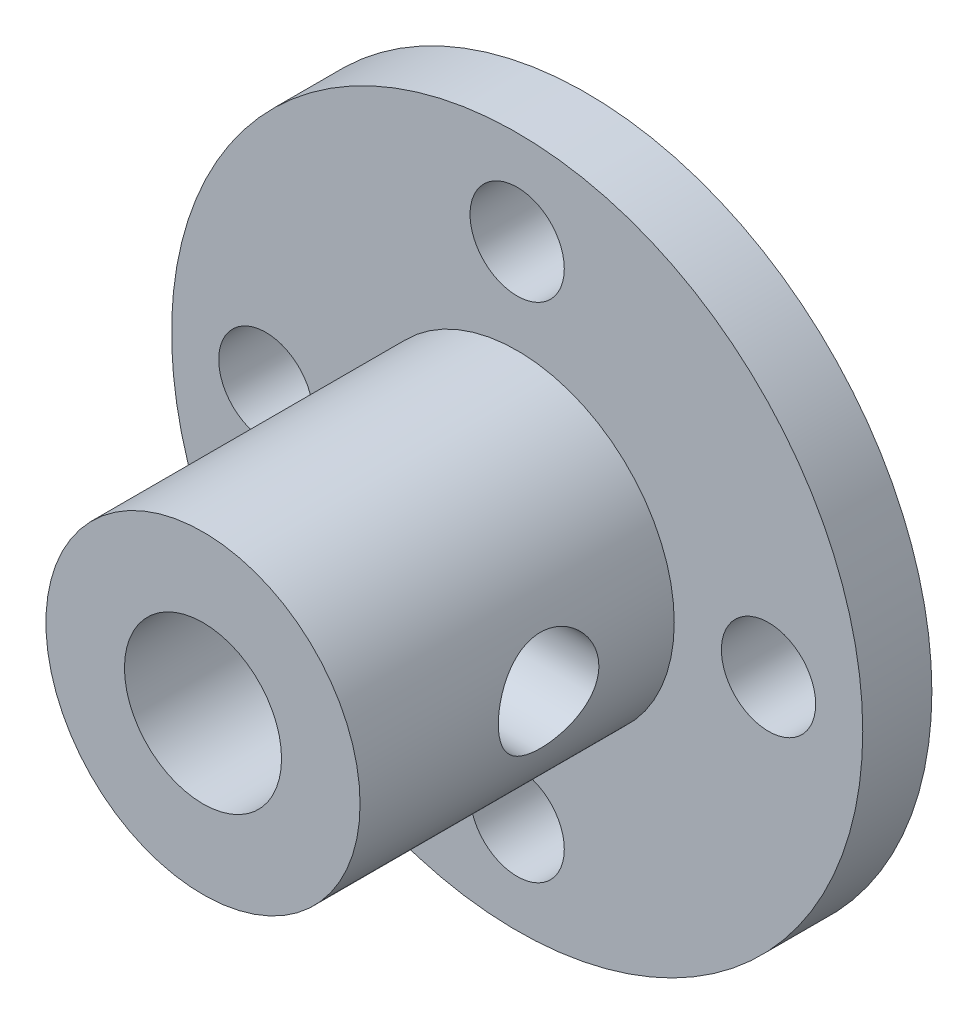
ISO-10303-21;
HEADER;
FILE_DESCRIPTION(('STEP AP214'),'2;1');
FILE_NAME('part.step','',(''),(''),'','','');
FILE_SCHEMA(('AUTOMOTIVE_DESIGN { 1 0 10303 214 1 1 1 1 }'));
ENDSEC;
DATA;
#1=APPLICATION_CONTEXT('core data for automotive mechanical design processes');
#2=APPLICATION_PROTOCOL_DEFINITION('international standard','automotive_design',2000,#1);
#3=PRODUCT_CONTEXT('',#1,'mechanical');
#4=PRODUCT('Part','Part','',(#3));
#5=PRODUCT_RELATED_PRODUCT_CATEGORY('part','',(#4));
#6=PRODUCT_DEFINITION_FORMATION('','',#4);
#7=PRODUCT_DEFINITION_CONTEXT('part definition',#1,'design');
#8=PRODUCT_DEFINITION('design','',#6,#7);
#9=PRODUCT_DEFINITION_SHAPE('','',#8);
#10=(LENGTH_UNIT() NAMED_UNIT(*) SI_UNIT(.MILLI.,.METRE.));
#11=(NAMED_UNIT(*) PLANE_ANGLE_UNIT() SI_UNIT($,.RADIAN.));
#12=(NAMED_UNIT(*) SI_UNIT($,.STERADIAN.) SOLID_ANGLE_UNIT());
#13=UNCERTAINTY_MEASURE_WITH_UNIT(LENGTH_MEASURE(1.E-05),#10,'distance_accuracy_value','');
#14=(GEOMETRIC_REPRESENTATION_CONTEXT(3) GLOBAL_UNCERTAINTY_ASSIGNED_CONTEXT((#13)) GLOBAL_UNIT_ASSIGNED_CONTEXT((#10,
#11,#12)) REPRESENTATION_CONTEXT('',''));
#15=CARTESIAN_POINT('',(0.,0.,0.));
#16=DIRECTION('',(0.,0.,1.));
#17=DIRECTION('',(1.,0.,0.));
#18=AXIS2_PLACEMENT_3D('',#15,#16,#17);
#19=CARTESIAN_POINT('',(10.,0.,6.2));
#20=DIRECTION('',(-1.,0.,0.));
#21=DIRECTION('',(0.,0.,1.));
#22=AXIS2_PLACEMENT_3D('',#19,#20,#21);
#23=CYLINDRICAL_SURFACE('',#22,1.6);
#24=CARTESIAN_POINT('',(2.5,0.,7.8));
#25=CARTESIAN_POINT('',(2.49999373478122,-0.0809465291327145,7.79999319952603));
#26=CARTESIAN_POINT('',(2.49602800483229,-0.161978714239318,7.79381558056889));
#27=CARTESIAN_POINT('',(2.48053880851594,-0.32153224087751,7.76944495751531));
#28=CARTESIAN_POINT('',(2.46900276007789,-0.400049173738109,7.75123194993052));
#29=CARTESIAN_POINT('',(2.43952804374761,-0.55196210358411,7.70387437682436));
#30=CARTESIAN_POINT('',(2.42162124050247,-0.625381451344332,7.67478417954403));
#31=CARTESIAN_POINT('',(2.38087710607185,-0.766024179803001,7.60688033401694));
#32=CARTESIAN_POINT('',(2.35804006543092,-0.83324792528244,7.56806725872894));
#33=CARTESIAN_POINT('',(2.30708893904171,-0.965808013791175,7.47833363387257));
#34=CARTESIAN_POINT('',(2.27869604004543,-1.03054049909709,7.42668255338378));
#35=CARTESIAN_POINT('',(2.2202876512534,-1.15100614853988,7.31443988035948));
#36=CARTESIAN_POINT('',(2.19026995344606,-1.20672663413539,7.25383591774473));
#37=CARTESIAN_POINT('',(2.12682160476874,-1.31573031751229,7.11526336388144));
#38=CARTESIAN_POINT('',(2.09351856777284,-1.36751904529823,7.03605091747256));
#39=CARTESIAN_POINT('',(2.03231641722274,-1.45692526208811,6.86811478723363));
#40=CARTESIAN_POINT('',(2.00440807432674,-1.4945670600244,6.77940775833639));
#41=CARTESIAN_POINT('',(1.96506941451095,-1.54571994621925,6.61926322550775));
#42=CARTESIAN_POINT('',(1.95122462500058,-1.56300203311439,6.54962803535412));
#43=CARTESIAN_POINT('',(1.93085974657065,-1.58809633195387,6.407668242363));
#44=CARTESIAN_POINT('',(1.92432852519843,-1.59592293813044,6.33534790062655));
#45=CARTESIAN_POINT('',(1.91958400971202,-1.60162869479516,6.1898063830809));
#46=CARTESIAN_POINT('',(1.92139642983109,-1.59947709333703,6.11658311696255));
#47=CARTESIAN_POINT('',(1.93310041934093,-1.58530767623303,5.97173437689421));
#48=CARTESIAN_POINT('',(1.94299865478456,-1.57328171999679,5.90011027138346));
#49=CARTESIAN_POINT('',(1.96901231320556,-1.54058583436826,5.76243945681372));
#50=CARTESIAN_POINT('',(1.9849337786339,-1.52018403097241,5.69629016654997));
#51=CARTESIAN_POINT('',(2.02122165880275,-1.47159113105818,5.56824456131714));
#52=CARTESIAN_POINT('',(2.04158954958855,-1.44339744710114,5.50634966763977));
#53=CARTESIAN_POINT('',(2.08922627037341,-1.37376676759635,5.37583729218258));
#54=CARTESIAN_POINT('',(2.11706797105538,-1.33082320515132,5.30823368135423));
#55=CARTESIAN_POINT('',(2.17399569817609,-1.23564764355399,5.18042453865553));
#56=CARTESIAN_POINT('',(2.20308316755738,-1.18340463932981,5.1202279166375));
#57=CARTESIAN_POINT('',(2.26543285211593,-1.05991806168005,4.99773049305388));
#58=CARTESIAN_POINT('',(2.29848920685381,-0.986946893268201,4.93704738515402));
#59=CARTESIAN_POINT('',(2.359688609273,-0.830022968093887,4.82882646418757));
#60=CARTESIAN_POINT('',(2.38783689397334,-0.746082085718439,4.78127460775573));
#61=CARTESIAN_POINT('',(2.43131140919962,-0.586635550991742,4.70938992265081));
#62=CARTESIAN_POINT('',(2.44807310922167,-0.512753928414282,4.68232335141115));
#63=CARTESIAN_POINT('',(2.47504180751747,-0.360710175816512,4.63919317805547));
#64=CARTESIAN_POINT('',(2.4852540740069,-0.28255154119559,4.62312073182003));
#65=CARTESIAN_POINT('',(2.49820514305433,-0.123815634695008,4.60278636243937));
#66=CARTESIAN_POINT('',(2.50091888316294,-0.0432311597035633,4.59856404544188));
#67=CARTESIAN_POINT('',(2.49852887198075,0.117542286289559,4.60229890585244));
#68=CARTESIAN_POINT('',(2.49342466188541,0.197731233802226,4.61025679806874));
#69=CARTESIAN_POINT('',(2.47637451376673,0.351006156661022,4.6371403917444));
#70=CARTESIAN_POINT('',(2.46480663552248,0.424243126849566,4.65546066900735));
#71=CARTESIAN_POINT('',(2.43607037965005,0.56641548443588,4.70174529959737));
#72=CARTESIAN_POINT('',(2.41890106050777,0.635350146361166,4.72971127425969));
#73=CARTESIAN_POINT('',(2.37877118462254,0.772615564352516,4.79667378205782));
#74=CARTESIAN_POINT('',(2.35547539636836,0.840521814887449,4.83633491763167));
#75=CARTESIAN_POINT('',(2.30558482599355,0.96904100986565,4.92444504674963));
#76=CARTESIAN_POINT('',(2.27898748986338,1.02964823562874,4.9729008572337));
#77=CARTESIAN_POINT('',(2.22016403044038,1.15157305211654,5.08564374885055));
#78=CARTESIAN_POINT('',(2.18769843253542,1.21158689465292,5.15121835007176));
#79=CARTESIAN_POINT('',(2.12390873827501,1.3202194969544,5.29175421120057));
#80=CARTESIAN_POINT('',(2.09258486725736,1.36883601745304,5.36671731126372));
#81=CARTESIAN_POINT('',(2.0386465958932,1.44771753628644,5.51434304861082));
#82=CARTESIAN_POINT('',(2.01542700480048,1.47958112170677,5.58592496939158));
#83=CARTESIAN_POINT('',(1.97524043785175,1.53282212869392,5.73452572718802));
#84=CARTESIAN_POINT('',(1.95826478854657,1.55421411012882,5.81153684383325));
#85=CARTESIAN_POINT('',(1.93305268936486,1.58547514853105,5.97011725657861));
#86=CARTESIAN_POINT('',(1.92489997570191,1.59523388426508,6.05172262499342));
#87=CARTESIAN_POINT('',(1.9192576474091,1.60202308952287,6.21580903395502));
#88=CARTESIAN_POINT('',(1.92176029238758,1.59906279853819,6.29828939544555));
#89=CARTESIAN_POINT('',(1.93577077408217,1.582047659125,6.44908417073445));
#90=CARTESIAN_POINT('',(1.94592963240223,1.56965222422199,6.51772783694089));
#91=CARTESIAN_POINT('',(1.97224844367527,1.53645153543922,6.65176514251973));
#92=CARTESIAN_POINT('',(1.98841434501085,1.51563794379522,6.71715548731856));
#93=CARTESIAN_POINT('',(2.03132559529756,1.45787799915052,6.86553346354275));
#94=CARTESIAN_POINT('',(2.05979688602195,1.41784373882589,6.94681769825829));
#95=CARTESIAN_POINT('',(2.12039210845437,1.32551551302481,7.10059848283189));
#96=CARTESIAN_POINT('',(2.15252094162923,1.27320499415655,7.17308296502062));
#97=CARTESIAN_POINT('',(2.21734561230738,1.15666472100032,7.30915958106083));
#98=CARTESIAN_POINT('',(2.25004367113503,1.09230184419142,7.3726369312985));
#99=CARTESIAN_POINT('',(2.31251135077165,0.952958939292202,7.48844176061278));
#100=CARTESIAN_POINT('',(2.34228091431827,0.8779787036652,7.54076902168938));
#101=CARTESIAN_POINT('',(2.39686635130216,0.715912032693984,7.63403158874599));
#102=CARTESIAN_POINT('',(2.42149529879162,0.628517200456207,7.67455323211732));
#103=CARTESIAN_POINT('',(2.45158227355125,0.491867628909333,7.72328979105351));
#104=CARTESIAN_POINT('',(2.46046425402859,0.44543000315537,7.73752123072786));
#105=CARTESIAN_POINT('',(2.4756864261471,0.35107264809978,7.76176635430105));
#106=CARTESIAN_POINT('',(2.48202839394244,0.3031539797922,7.77178298573697));
#107=CARTESIAN_POINT('',(2.49128524954684,0.212785198573042,7.78635718850864));
#108=CARTESIAN_POINT('',(2.49454442057938,0.170458191835634,7.79146469810607));
#109=CARTESIAN_POINT('',(2.4989034737162,0.0854287505360257,7.79828793695967));
#110=CARTESIAN_POINT('',(2.50000330699373,0.0427263075064228,7.80000358951947));
#111=CARTESIAN_POINT('',(2.5,0.,7.8));
#112=B_SPLINE_CURVE_WITH_KNOTS('',3,(#24,#25,#26,#27,#28,#29,#30,#31,#32,#33,#34,#35,#36,#37,
#38,#39,#40,#41,#42,#43,#44,#45,#46,#47,#48,#49,#50,#51,#52,#53,#54,#55,#56,#57,#58,#59,#60,#61,
#62,#63,#64,#65,#66,#67,#68,#69,#70,#71,#72,#73,#74,#75,#76,#77,#78,#79,#80,#81,#82,#83,#84,#85,
#86,#87,#88,#89,#90,#91,#92,#93,#94,#95,#96,#97,#98,#99,#100,#101,#102,#103,#104,#105,#106,#107,
#108,#109,#110,#111),.UNSPECIFIED.,.T.,.F.,(4,2,2,2,2,2,2,2,2,2,2,2,2,2,2,2,2,2,2,2,2,2,2,2,2,2,
2,2,2,2,2,2,2,2,2,2,2,2,2,2,2,2,2,4),(0.,0.242668102535664,0.485740550885228,0.727613930252439,
0.969473059632696,1.23110984524596,1.4931115719164,1.79267227249295,2.09171585301315,
2.31003384448275,2.52801906643513,2.74667654507805,2.96551446997264,3.17783438970215,
3.39022489909452,3.64367853296952,3.89743412554235,4.1974590010126,4.49716175776393,
4.7374824656454,4.9776096217435,5.21853839358543,5.459481305125,5.68761800492926,
5.91579307069755,6.1609022281819,6.40620219274237,6.68894601761175,6.97174534754924,
7.21597374489126,7.45986159214767,7.70604434827074,7.95204829992844,8.16261918551679,
8.37339914379897,8.65683208165382,8.94064942091189,9.22780941070396,9.51497501436513,
9.8112428791998,9.95914584209686,10.1069451995842,10.2350307103854,10.3631191174119),.UNSPECIFIED.);
#113=CARTESIAN_POINT('',(2.5,0.,7.8));
#114=VERTEX_POINT('',#113);
#115=EDGE_CURVE('E40',#114,#114,#112,.T.);
#116=ORIENTED_EDGE('',*,*,#115,.F.);
#117=EDGE_LOOP('',(#116));
#118=FACE_BOUND('',#117,.T.);
#119=CARTESIAN_POINT('',(5.,0.,7.8));
#120=CARTESIAN_POINT('',(4.99999978543627,-0.0874958063159797,7.79999975634942));
#121=CARTESIAN_POINT('',(4.99768184156355,-0.174994637059061,7.79279940472075));
#122=CARTESIAN_POINT('',(4.98866262172227,-0.347426901237483,7.76426818047074));
#123=CARTESIAN_POINT('',(4.98196054553558,-0.432359863373708,7.74293472818209));
#124=CARTESIAN_POINT('',(4.9649038363541,-0.597149225791565,7.68693507878823));
#125=CARTESIAN_POINT('',(4.95455502045191,-0.677013473384595,7.6522901076294));
#126=CARTESIAN_POINT('',(4.93126901642872,-0.829798762851157,7.57074316991274));
#127=CARTESIAN_POINT('',(4.91833138300386,-0.902718607024946,7.52383909423439));
#128=CARTESIAN_POINT('',(4.89077067933825,-1.04189475779498,7.41751588649597));
#129=CARTESIAN_POINT('',(4.87610957732918,-1.1078960922464,7.35777290104658));
#130=CARTESIAN_POINT('',(4.8469706570307,-1.22913423693228,7.22815693345259));
#131=CARTESIAN_POINT('',(4.83249287552328,-1.28436891793797,7.15828195234513));
#132=CARTESIAN_POINT('',(4.8049481079903,-1.38391395073831,7.00814714548962));
#133=CARTESIAN_POINT('',(4.79192785635417,-1.42790123109944,6.92766371872946));
#134=CARTESIAN_POINT('',(4.76934657798646,-1.5016091713459,6.75995765622989));
#135=CARTESIAN_POINT('',(4.75978458968016,-1.53133379773326,6.6727369020117));
#136=CARTESIAN_POINT('',(4.74560122760597,-1.57473134311321,6.49691739272712));
#137=CARTESIAN_POINT('',(4.74083414932744,-1.58887896846385,6.40844789824797));
#138=CARTESIAN_POINT('',(4.73634831045,-1.60220433058851,6.23027240081554));
#139=CARTESIAN_POINT('',(4.73662813227306,-1.6013862709372,6.14056675214803));
#140=CARTESIAN_POINT('',(4.74207619100075,-1.58517380736381,5.96643441511176));
#141=CARTESIAN_POINT('',(4.7470401743042,-1.57038842132725,5.8819435465553));
#142=CARTESIAN_POINT('',(4.76096457446162,-1.52765058974139,5.71671115557794));
#143=CARTESIAN_POINT('',(4.76992543490025,-1.49969668269327,5.6359700504148));
#144=CARTESIAN_POINT('',(4.7909865416364,-1.43099645158812,5.47910214117426));
#145=CARTESIAN_POINT('',(4.80313229469362,-1.39006273103722,5.40306378004853));
#146=CARTESIAN_POINT('',(4.82917444861168,-1.29669494334068,5.25873795697323));
#147=CARTESIAN_POINT('',(4.8430713221454,-1.24425776827155,5.19045259725646));
#148=CARTESIAN_POINT('',(4.87186372141871,-1.12640551540387,5.06013532713372));
#149=CARTESIAN_POINT('',(4.8867752080818,-1.06048936249402,4.99855922306119));
#150=CARTESIAN_POINT('',(4.91533168114877,-0.919081432217149,4.88722132176635));
#151=CARTESIAN_POINT('',(4.92897656433707,-0.843588875652695,4.83746048685711));
#152=CARTESIAN_POINT('',(4.95361789744584,-0.684261580712375,4.75083655671978));
#153=CARTESIAN_POINT('',(4.96459080547942,-0.600361279440636,4.71408689916357));
#154=CARTESIAN_POINT('',(4.98248161100196,-0.427135850361131,4.65536040333729));
#155=CARTESIAN_POINT('',(4.98940080204637,-0.337812463131549,4.63337885218328));
#156=CARTESIAN_POINT('',(4.99819424239135,-0.160141789589319,4.60559993333478));
#157=CARTESIAN_POINT('',(5.00026060178154,-0.0719002860170741,4.5991859263889));
#158=CARTESIAN_POINT('',(4.99968655318444,0.104410269588105,4.6009792182213));
#159=CARTESIAN_POINT('',(4.99704687004206,0.192479346087439,4.60918426530988));
#160=CARTESIAN_POINT('',(4.98748380317497,0.363535018203812,4.63949011308117));
#161=CARTESIAN_POINT('',(4.98067486649266,0.446594362478022,4.6612199100859));
#162=CARTESIAN_POINT('',(4.96357585995349,0.607861654600582,4.71750179939625));
#163=CARTESIAN_POINT('',(4.95328535439547,0.686068993794125,4.75205549660218));
#164=CARTESIAN_POINT('',(4.92995531019905,0.837596923870445,4.83397101717815));
#165=CARTESIAN_POINT('',(4.9168532627009,0.910745620500966,4.88163251194231));
#166=CARTESIAN_POINT('',(4.8893940824048,1.04821150300662,4.98805387298564));
#167=CARTESIAN_POINT('',(4.87503659432078,1.11252617555398,5.0468168864583));
#168=CARTESIAN_POINT('',(4.84592967283237,1.23328321488635,5.17667415961096));
#169=CARTESIAN_POINT('',(4.83118884166735,1.2892857947562,5.24818026768848));
#170=CARTESIAN_POINT('',(4.80360443110145,1.38854141992569,5.39989467445821));
#171=CARTESIAN_POINT('',(4.79076083607138,1.43179457025642,5.48010290145405));
#172=CARTESIAN_POINT('',(4.76856262886575,1.50407580301231,5.64684357865608));
#173=CARTESIAN_POINT('',(4.75919656820051,1.53315066307446,5.73335413498969));
#174=CARTESIAN_POINT('',(4.74511281699328,1.57620668246201,5.91040720981033));
#175=CARTESIAN_POINT('',(4.74039324536734,1.59019395006567,6.00094808113599));
#176=CARTESIAN_POINT('',(4.73633927898768,1.60222535311566,6.17887596916399));
#177=CARTESIAN_POINT('',(4.73676019091382,1.60099388446006,6.26620901132899));
#178=CARTESIAN_POINT('',(4.74234159093745,1.5843835514937,6.4393570054347));
#179=CARTESIAN_POINT('',(4.74750183734632,1.56900540861121,6.52517203456103));
#180=CARTESIAN_POINT('',(4.76180543144416,1.52503332416461,6.69148342537688));
#181=CARTESIAN_POINT('',(4.77088327236763,1.49665627942706,6.77204319889287));
#182=CARTESIAN_POINT('',(4.79197975594362,1.42766427484382,6.92732176040081));
#183=CARTESIAN_POINT('',(4.8039990169992,1.38704674114626,7.0020393157627));
#184=CARTESIAN_POINT('',(4.83023494368376,1.29279266707432,7.14680962981441));
#185=CARTESIAN_POINT('',(4.8445211905268,1.23869308431579,7.21654826273404));
#186=CARTESIAN_POINT('',(4.87337180847353,1.11981399792885,7.34619174582096));
#187=CARTESIAN_POINT('',(4.88793625446696,1.05503158166823,7.40609390519865));
#188=CARTESIAN_POINT('',(4.91631108200117,0.913912210298352,7.51645828592383));
#189=CARTESIAN_POINT('',(4.93007751880386,0.83725135176078,7.56651895188431));
#190=CARTESIAN_POINT('',(4.95473787697861,0.676163529926937,7.65298018809723));
#191=CARTESIAN_POINT('',(4.96563279071293,0.591739263208157,7.6893854793208));
#192=CARTESIAN_POINT('',(4.98268341064065,0.423663431644845,7.74524777983044));
#193=CARTESIAN_POINT('',(4.98911901301451,0.34037676648733,7.76571845058311));
#194=CARTESIAN_POINT('',(4.99777693541394,0.171394001076119,7.79309314290401));
#195=CARTESIAN_POINT('',(5.00000021015613,0.0856984512613946,7.80000023864547));
#196=CARTESIAN_POINT('',(5.,0.,7.8));
#197=B_SPLINE_CURVE_WITH_KNOTS('',3,(#119,#120,#121,#122,#123,#124,#125,#126,#127,#128,#129,
#130,#131,#132,#133,#134,#135,#136,#137,#138,#139,#140,#141,#142,#143,#144,#145,#146,#147,#148,
#149,#150,#151,#152,#153,#154,#155,#156,#157,#158,#159,#160,#161,#162,#163,#164,#165,#166,#167,
#168,#169,#170,#171,#172,#173,#174,#175,#176,#177,#178,#179,#180,#181,#182,#183,#184,#185,#186,
#187,#188,#189,#190,#191,#192,#193,#194,#195,#196),.UNSPECIFIED.,.T.,.F.,(4,2,2,2,2,2,2,2,2,2,2,
2,2,2,2,2,2,2,2,2,2,2,2,2,2,2,2,2,2,2,2,2,2,2,2,2,2,2,4),(0.,0.262172289866487,
0.524392446348364,0.786196202111712,1.04804502964703,1.31749718151567,1.58700256668426,
1.86354828826627,2.14001705671955,2.40780489999507,2.67551752794223,2.93207089351445,
3.18865273918778,3.44912195934763,3.70966163813009,3.98267284808623,4.25570628624555,
4.53106471334194,4.80633522466348,5.07051010591344,5.33464430132699,5.59183416387789,
5.84905622438333,6.11273355055081,6.37648573964818,6.6512299305306,6.92597185797942,
7.19980110675104,7.47351945288796,7.73426134972847,7.99498995042988,8.25151822881316,
8.50810048600705,8.77513756675922,9.04224757485583,9.3186628553126,9.5949824844973,
9.85182740305348,10.1086141011961),.UNSPECIFIED.);
#198=CARTESIAN_POINT('',(5.,0.,7.8));
#199=VERTEX_POINT('',#198);
#200=EDGE_CURVE('E75',#199,#199,#197,.T.);
#201=ORIENTED_EDGE('',*,*,#200,.T.);
#202=EDGE_LOOP('',(#201));
#203=FACE_BOUND('',#202,.T.);
#204=ADVANCED_FACE('F36',(#118,#203),#23,.F.);
#205=CARTESIAN_POINT('',(0.,0.,12.2));
#206=DIRECTION('',(0.,0.,-1.));
#207=DIRECTION('',(-1.,0.,0.));
#208=AXIS2_PLACEMENT_3D('',#205,#206,#207);
#209=CYLINDRICAL_SURFACE('',#208,5.);
#210=CARTESIAN_POINT('',(0.,0.,12.2));
#211=DIRECTION('',(0.,0.,1.));
#212=DIRECTION('',(1.,0.,0.));
#213=AXIS2_PLACEMENT_3D('',#210,#211,#212);
#214=CIRCLE('',#213,5.);
#215=CARTESIAN_POINT('',(5.,0.,12.2));
#216=VERTEX_POINT('',#215);
#217=EDGE_CURVE('E57',#216,#216,#214,.T.);
#218=ORIENTED_EDGE('',*,*,#217,.F.);
#219=EDGE_LOOP('',(#218));
#220=FACE_BOUND('',#219,.T.);
#221=CARTESIAN_POINT('',(0.,0.,2.2));
#222=DIRECTION('',(0.,0.,1.));
#223=DIRECTION('',(1.,0.,0.));
#224=AXIS2_PLACEMENT_3D('',#221,#222,#223);
#225=CIRCLE('',#224,5.);
#226=CARTESIAN_POINT('',(5.,0.,2.2));
#227=VERTEX_POINT('',#226);
#228=EDGE_CURVE('E10',#227,#227,#225,.T.);
#229=ORIENTED_EDGE('',*,*,#228,.T.);
#230=EDGE_LOOP('',(#229));
#231=FACE_BOUND('',#230,.T.);
#232=ORIENTED_EDGE('',*,*,#200,.F.);
#233=EDGE_LOOP('',(#232));
#234=FACE_BOUND('',#233,.T.);
#235=CARTESIAN_POINT('',(-5.,0.,7.8));
#236=CARTESIAN_POINT('',(-4.99999978543627,0.0874958063159797,7.79999975634942));
#237=CARTESIAN_POINT('',(-4.99768184156355,0.174994637059061,7.79279940472075));
#238=CARTESIAN_POINT('',(-4.98866262172227,0.347426901237483,7.76426818047074));
#239=CARTESIAN_POINT('',(-4.98196054553558,0.432359863373708,7.74293472818209));
#240=CARTESIAN_POINT('',(-4.9649038363541,0.597149225791565,7.68693507878823));
#241=CARTESIAN_POINT('',(-4.95455502045191,0.677013473384595,7.6522901076294));
#242=CARTESIAN_POINT('',(-4.93126901642872,0.829798762851157,7.57074316991274));
#243=CARTESIAN_POINT('',(-4.91833138300386,0.902718607024946,7.52383909423439));
#244=CARTESIAN_POINT('',(-4.89077067933825,1.04189475779498,7.41751588649597));
#245=CARTESIAN_POINT('',(-4.87610957732918,1.1078960922464,7.35777290104658));
#246=CARTESIAN_POINT('',(-4.8469706570307,1.22913423693228,7.22815693345259));
#247=CARTESIAN_POINT('',(-4.83249287552328,1.28436891793797,7.15828195234513));
#248=CARTESIAN_POINT('',(-4.8049481079903,1.38391395073831,7.00814714548962));
#249=CARTESIAN_POINT('',(-4.79192785635417,1.42790123109944,6.92766371872946));
#250=CARTESIAN_POINT('',(-4.76934657798646,1.5016091713459,6.75995765622989));
#251=CARTESIAN_POINT('',(-4.75978458968016,1.53133379773326,6.6727369020117));
#252=CARTESIAN_POINT('',(-4.74560122760597,1.57473134311321,6.49691739272712));
#253=CARTESIAN_POINT('',(-4.74083414932744,1.58887896846385,6.40844789824797));
#254=CARTESIAN_POINT('',(-4.73634831045,1.60220433058851,6.23027240081554));
#255=CARTESIAN_POINT('',(-4.73662813227306,1.6013862709372,6.14056675214803));
#256=CARTESIAN_POINT('',(-4.74207619100075,1.58517380736381,5.96643441511176));
#257=CARTESIAN_POINT('',(-4.7470401743042,1.57038842132725,5.8819435465553));
#258=CARTESIAN_POINT('',(-4.76096457446162,1.52765058974139,5.71671115557794));
#259=CARTESIAN_POINT('',(-4.76992543490025,1.49969668269327,5.6359700504148));
#260=CARTESIAN_POINT('',(-4.7909865416364,1.43099645158812,5.47910214117426));
#261=CARTESIAN_POINT('',(-4.80313229469362,1.39006273103722,5.40306378004853));
#262=CARTESIAN_POINT('',(-4.82917444861168,1.29669494334068,5.25873795697323));
#263=CARTESIAN_POINT('',(-4.8430713221454,1.24425776827155,5.19045259725646));
#264=CARTESIAN_POINT('',(-4.87186372141871,1.12640551540387,5.06013532713372));
#265=CARTESIAN_POINT('',(-4.8867752080818,1.06048936249402,4.99855922306119));
#266=CARTESIAN_POINT('',(-4.91533168114877,0.919081432217149,4.88722132176635));
#267=CARTESIAN_POINT('',(-4.92897656433707,0.843588875652695,4.83746048685711));
#268=CARTESIAN_POINT('',(-4.95361789744584,0.684261580712375,4.75083655671978));
#269=CARTESIAN_POINT('',(-4.96459080547942,0.600361279440636,4.71408689916357));
#270=CARTESIAN_POINT('',(-4.98248161100196,0.427135850361131,4.65536040333729));
#271=CARTESIAN_POINT('',(-4.98940080204637,0.337812463131549,4.63337885218328));
#272=CARTESIAN_POINT('',(-4.99819424239135,0.160141789589319,4.60559993333478));
#273=CARTESIAN_POINT('',(-5.00026060178154,0.0719002860170741,4.5991859263889));
#274=CARTESIAN_POINT('',(-4.99968655318444,-0.104410269588105,4.6009792182213));
#275=CARTESIAN_POINT('',(-4.99704687004206,-0.192479346087439,4.60918426530988));
#276=CARTESIAN_POINT('',(-4.98748380317497,-0.363535018203812,4.63949011308117));
#277=CARTESIAN_POINT('',(-4.98067486649266,-0.446594362478022,4.6612199100859));
#278=CARTESIAN_POINT('',(-4.96357585995349,-0.607861654600582,4.71750179939625));
#279=CARTESIAN_POINT('',(-4.95328535439547,-0.686068993794125,4.75205549660218));
#280=CARTESIAN_POINT('',(-4.92995531019905,-0.837596923870445,4.83397101717815));
#281=CARTESIAN_POINT('',(-4.9168532627009,-0.910745620500966,4.88163251194231));
#282=CARTESIAN_POINT('',(-4.8893940824048,-1.04821150300662,4.98805387298564));
#283=CARTESIAN_POINT('',(-4.87503659432078,-1.11252617555398,5.0468168864583));
#284=CARTESIAN_POINT('',(-4.84592967283237,-1.23328321488635,5.17667415961096));
#285=CARTESIAN_POINT('',(-4.83118884166735,-1.2892857947562,5.24818026768848));
#286=CARTESIAN_POINT('',(-4.80360443110145,-1.38854141992569,5.39989467445821));
#287=CARTESIAN_POINT('',(-4.79076083607138,-1.43179457025642,5.48010290145405));
#288=CARTESIAN_POINT('',(-4.76856262886575,-1.50407580301231,5.64684357865608));
#289=CARTESIAN_POINT('',(-4.75919656820051,-1.53315066307446,5.73335413498969));
#290=CARTESIAN_POINT('',(-4.74511281699328,-1.57620668246201,5.91040720981033));
#291=CARTESIAN_POINT('',(-4.74039324536734,-1.59019395006567,6.00094808113599));
#292=CARTESIAN_POINT('',(-4.73633927898768,-1.60222535311566,6.17887596916399));
#293=CARTESIAN_POINT('',(-4.73676019091382,-1.60099388446006,6.26620901132899));
#294=CARTESIAN_POINT('',(-4.74234159093745,-1.5843835514937,6.4393570054347));
#295=CARTESIAN_POINT('',(-4.74750183734632,-1.56900540861121,6.52517203456103));
#296=CARTESIAN_POINT('',(-4.76180543144416,-1.52503332416461,6.69148342537688));
#297=CARTESIAN_POINT('',(-4.77088327236763,-1.49665627942706,6.77204319889287));
#298=CARTESIAN_POINT('',(-4.79197975594362,-1.42766427484382,6.92732176040081));
#299=CARTESIAN_POINT('',(-4.8039990169992,-1.38704674114626,7.0020393157627));
#300=CARTESIAN_POINT('',(-4.83023494368376,-1.29279266707432,7.14680962981441));
#301=CARTESIAN_POINT('',(-4.8445211905268,-1.23869308431579,7.21654826273404));
#302=CARTESIAN_POINT('',(-4.87337180847353,-1.11981399792885,7.34619174582096));
#303=CARTESIAN_POINT('',(-4.88793625446696,-1.05503158166823,7.40609390519865));
#304=CARTESIAN_POINT('',(-4.91631108200117,-0.913912210298352,7.51645828592383));
#305=CARTESIAN_POINT('',(-4.93007751880386,-0.83725135176078,7.56651895188431));
#306=CARTESIAN_POINT('',(-4.95473787697861,-0.676163529926937,7.65298018809723));
#307=CARTESIAN_POINT('',(-4.96563279071293,-0.591739263208157,7.6893854793208));
#308=CARTESIAN_POINT('',(-4.98268341064065,-0.423663431644845,7.74524777983044));
#309=CARTESIAN_POINT('',(-4.98911901301451,-0.34037676648733,7.76571845058311));
#310=CARTESIAN_POINT('',(-4.99777693541394,-0.171394001076119,7.79309314290401));
#311=CARTESIAN_POINT('',(-5.00000021015613,-0.0856984512613946,7.80000023864547));
#312=CARTESIAN_POINT('',(-5.,0.,7.8));
#313=B_SPLINE_CURVE_WITH_KNOTS('',3,(#235,#236,#237,#238,#239,#240,#241,#242,#243,#244,#245,
#246,#247,#248,#249,#250,#251,#252,#253,#254,#255,#256,#257,#258,#259,#260,#261,#262,#263,#264,
#265,#266,#267,#268,#269,#270,#271,#272,#273,#274,#275,#276,#277,#278,#279,#280,#281,#282,#283,
#284,#285,#286,#287,#288,#289,#290,#291,#292,#293,#294,#295,#296,#297,#298,#299,#300,#301,#302,
#303,#304,#305,#306,#307,#308,#309,#310,#311,#312),.UNSPECIFIED.,.T.,.F.,(4,2,2,2,2,2,2,2,2,2,2,
2,2,2,2,2,2,2,2,2,2,2,2,2,2,2,2,2,2,2,2,2,2,2,2,2,2,2,4),(0.,0.262172289866487,
0.524392446348364,0.786196202111712,1.04804502964703,1.31749718151567,1.58700256668426,
1.86354828826627,2.14001705671955,2.40780489999507,2.67551752794223,2.93207089351445,
3.18865273918778,3.44912195934763,3.70966163813009,3.98267284808623,4.25570628624555,
4.53106471334194,4.80633522466348,5.07051010591344,5.33464430132699,5.59183416387789,
5.84905622438333,6.11273355055081,6.37648573964818,6.6512299305306,6.92597185797942,
7.19980110675104,7.47351945288796,7.73426134972847,7.99498995042988,8.25151822881316,
8.50810048600705,8.77513756675922,9.04224757485583,9.3186628553126,9.5949824844973,
9.85182740305348,10.1086141011961),.UNSPECIFIED.);
#314=CARTESIAN_POINT('',(-5.,0.,7.8));
#315=VERTEX_POINT('',#314);
#316=EDGE_CURVE('E82',#315,#315,#313,.T.);
#317=ORIENTED_EDGE('',*,*,#316,.F.);
#318=EDGE_LOOP('',(#317));
#319=FACE_BOUND('',#318,.T.);
#320=ADVANCED_FACE('F87',(#220,#231,#234,#319),#209,.T.);
#321=CARTESIAN_POINT('',(0.,0.,2.2));
#322=DIRECTION('',(0.,0.,-1.));
#323=DIRECTION('',(-1.,0.,0.));
#324=AXIS2_PLACEMENT_3D('',#321,#322,#323);
#325=CYLINDRICAL_SURFACE('',#324,11.);
#326=CARTESIAN_POINT('',(0.,0.,2.2));
#327=DIRECTION('',(0.,0.,1.));
#328=DIRECTION('',(1.,0.,0.));
#329=AXIS2_PLACEMENT_3D('',#326,#327,#328);
#330=CIRCLE('',#329,11.);
#331=CARTESIAN_POINT('',(11.,0.,2.2));
#332=VERTEX_POINT('',#331);
#333=EDGE_CURVE('E49',#332,#332,#330,.T.);
#334=ORIENTED_EDGE('',*,*,#333,.F.);
#335=EDGE_LOOP('',(#334));
#336=FACE_BOUND('',#335,.T.);
#337=CARTESIAN_POINT('',(0.,0.,0.));
#338=DIRECTION('',(0.,0.,1.));
#339=DIRECTION('',(1.,0.,0.));
#340=AXIS2_PLACEMENT_3D('',#337,#338,#339);
#341=CIRCLE('',#340,11.);
#342=CARTESIAN_POINT('',(11.,0.,0.));
#343=VERTEX_POINT('',#342);
#344=EDGE_CURVE('E54',#343,#343,#341,.T.);
#345=ORIENTED_EDGE('',*,*,#344,.T.);
#346=EDGE_LOOP('',(#345));
#347=FACE_BOUND('',#346,.T.);
#348=ADVANCED_FACE('F38',(#336,#347),#325,.T.);
#349=CARTESIAN_POINT('',(0.,0.,2.2));
#350=DIRECTION('',(0.,0.,1.));
#351=DIRECTION('',(1.,0.,0.));
#352=AXIS2_PLACEMENT_3D('',#349,#350,#351);
#353=PLANE('',#352);
#354=CARTESIAN_POINT('',(8.,0.,2.2));
#355=DIRECTION('',(0.,0.,1.));
#356=DIRECTION('',(1.,0.,0.));
#357=AXIS2_PLACEMENT_3D('',#354,#355,#356);
#358=CIRCLE('',#357,1.5);
#359=CARTESIAN_POINT('',(9.5,0.,2.2));
#360=VERTEX_POINT('',#359);
#361=EDGE_CURVE('E66',#360,#360,#358,.T.);
#362=ORIENTED_EDGE('',*,*,#361,.F.);
#363=EDGE_LOOP('',(#362));
#364=FACE_BOUND('',#363,.T.);
#365=CARTESIAN_POINT('',(0.,-8.,2.2));
#366=DIRECTION('',(0.,0.,1.));
#367=DIRECTION('',(1.,0.,0.));
#368=AXIS2_PLACEMENT_3D('',#365,#366,#367);
#369=CIRCLE('',#368,1.5);
#370=CARTESIAN_POINT('',(1.49999999999997,-8.,2.2));
#371=VERTEX_POINT('',#370);
#372=EDGE_CURVE('E121',#371,#371,#369,.T.);
#373=ORIENTED_EDGE('',*,*,#372,.F.);
#374=EDGE_LOOP('',(#373));
#375=FACE_BOUND('',#374,.T.);
#376=CARTESIAN_POINT('',(-8.,0.,2.2));
#377=DIRECTION('',(0.,0.,1.));
#378=DIRECTION('',(1.,0.,0.));
#379=AXIS2_PLACEMENT_3D('',#376,#377,#378);
#380=CIRCLE('',#379,1.5);
#381=CARTESIAN_POINT('',(-6.5,0.,2.2));
#382=VERTEX_POINT('',#381);
#383=EDGE_CURVE('E124',#382,#382,#380,.T.);
#384=ORIENTED_EDGE('',*,*,#383,.F.);
#385=EDGE_LOOP('',(#384));
#386=FACE_BOUND('',#385,.T.);
#387=CARTESIAN_POINT('',(0.,8.,2.2));
#388=DIRECTION('',(0.,0.,1.));
#389=DIRECTION('',(1.,0.,0.));
#390=AXIS2_PLACEMENT_3D('',#387,#388,#389);
#391=CIRCLE('',#390,1.5);
#392=CARTESIAN_POINT('',(1.50000000000008,8.,2.2));
#393=VERTEX_POINT('',#392);
#394=EDGE_CURVE('E126',#393,#393,#391,.T.);
#395=ORIENTED_EDGE('',*,*,#394,.F.);
#396=EDGE_LOOP('',(#395));
#397=FACE_BOUND('',#396,.T.);
#398=ORIENTED_EDGE('',*,*,#228,.F.);
#399=EDGE_LOOP('',(#398));
#400=FACE_BOUND('',#399,.T.);
#401=ORIENTED_EDGE('',*,*,#333,.T.);
#402=EDGE_LOOP('',(#401));
#403=FACE_BOUND('',#402,.T.);
#404=ADVANCED_FACE('F141',(#364,#375,#386,#397,#400,#403),#353,.T.);
#405=CARTESIAN_POINT('',(0.,0.,0.));
#406=DIRECTION('',(0.,0.,1.));
#407=DIRECTION('',(1.,0.,0.));
#408=AXIS2_PLACEMENT_3D('',#405,#406,#407);
#409=PLANE('',#408);
#410=CARTESIAN_POINT('',(0.,0.,0.));
#411=DIRECTION('',(0.,0.,-1.));
#412=DIRECTION('',(-1.,0.,0.));
#413=AXIS2_PLACEMENT_3D('',#410,#411,#412);
#414=CIRCLE('',#413,2.5);
#415=CARTESIAN_POINT('',(-2.5,0.,0.));
#416=VERTEX_POINT('',#415);
#417=EDGE_CURVE('E108',#416,#416,#414,.T.);
#418=ORIENTED_EDGE('',*,*,#417,.F.);
#419=EDGE_LOOP('',(#418));
#420=FACE_BOUND('',#419,.T.);
#421=CARTESIAN_POINT('',(8.,0.,0.));
#422=DIRECTION('',(0.,0.,1.));
#423=DIRECTION('',(1.,0.,0.));
#424=AXIS2_PLACEMENT_3D('',#421,#422,#423);
#425=CIRCLE('',#424,1.5);
#426=CARTESIAN_POINT('',(9.5,0.,0.));
#427=VERTEX_POINT('',#426);
#428=EDGE_CURVE('E72',#427,#427,#425,.T.);
#429=ORIENTED_EDGE('',*,*,#428,.T.);
#430=EDGE_LOOP('',(#429));
#431=FACE_BOUND('',#430,.T.);
#432=CARTESIAN_POINT('',(0.,-8.,0.));
#433=DIRECTION('',(0.,0.,1.));
#434=DIRECTION('',(1.,0.,0.));
#435=AXIS2_PLACEMENT_3D('',#432,#433,#434);
#436=CIRCLE('',#435,1.5);
#437=CARTESIAN_POINT('',(1.49999999999997,-8.,0.));
#438=VERTEX_POINT('',#437);
#439=EDGE_CURVE('E69',#438,#438,#436,.T.);
#440=ORIENTED_EDGE('',*,*,#439,.T.);
#441=EDGE_LOOP('',(#440));
#442=FACE_BOUND('',#441,.T.);
#443=CARTESIAN_POINT('',(-8.,0.,0.));
#444=DIRECTION('',(0.,0.,1.));
#445=DIRECTION('',(1.,0.,0.));
#446=AXIS2_PLACEMENT_3D('',#443,#444,#445);
#447=CIRCLE('',#446,1.5);
#448=CARTESIAN_POINT('',(-6.5,0.,0.));
#449=VERTEX_POINT('',#448);
#450=EDGE_CURVE('E65',#449,#449,#447,.T.);
#451=ORIENTED_EDGE('',*,*,#450,.T.);
#452=EDGE_LOOP('',(#451));
#453=FACE_BOUND('',#452,.T.);
#454=CARTESIAN_POINT('',(0.,8.,0.));
#455=DIRECTION('',(0.,0.,1.));
#456=DIRECTION('',(1.,0.,0.));
#457=AXIS2_PLACEMENT_3D('',#454,#455,#456);
#458=CIRCLE('',#457,1.5);
#459=CARTESIAN_POINT('',(1.50000000000008,8.,0.));
#460=VERTEX_POINT('',#459);
#461=EDGE_CURVE('E62',#460,#460,#458,.T.);
#462=ORIENTED_EDGE('',*,*,#461,.T.);
#463=EDGE_LOOP('',(#462));
#464=FACE_BOUND('',#463,.T.);
#465=ORIENTED_EDGE('',*,*,#344,.F.);
#466=EDGE_LOOP('',(#465));
#467=FACE_BOUND('',#466,.T.);
#468=ADVANCED_FACE('F153',(#420,#431,#442,#453,#464,#467),#409,.F.);
#469=CARTESIAN_POINT('',(0.,0.,12.2));
#470=DIRECTION('',(0.,0.,1.));
#471=DIRECTION('',(1.,0.,0.));
#472=AXIS2_PLACEMENT_3D('',#469,#470,#471);
#473=PLANE('',#472);
#474=CARTESIAN_POINT('',(0.,0.,12.2));
#475=DIRECTION('',(0.,0.,1.));
#476=DIRECTION('',(1.,0.,0.));
#477=AXIS2_PLACEMENT_3D('',#474,#475,#476);
#478=CIRCLE('',#477,2.5);
#479=CARTESIAN_POINT('',(2.5,0.,12.2));
#480=VERTEX_POINT('',#479);
#481=EDGE_CURVE('E83',#480,#480,#478,.T.);
#482=ORIENTED_EDGE('',*,*,#481,.F.);
#483=EDGE_LOOP('',(#482));
#484=FACE_BOUND('',#483,.T.);
#485=ORIENTED_EDGE('',*,*,#217,.T.);
#486=EDGE_LOOP('',(#485));
#487=FACE_BOUND('',#486,.T.);
#488=ADVANCED_FACE('F150',(#484,#487),#473,.T.);
#489=CARTESIAN_POINT('',(0.,8.,-7.8));
#490=DIRECTION('',(0.,0.,1.));
#491=DIRECTION('',(1.,0.,0.));
#492=AXIS2_PLACEMENT_3D('',#489,#490,#491);
#493=CYLINDRICAL_SURFACE('',#492,1.5);
#494=ORIENTED_EDGE('',*,*,#394,.T.);
#495=EDGE_LOOP('',(#494));
#496=FACE_BOUND('',#495,.T.);
#497=ORIENTED_EDGE('',*,*,#461,.F.);
#498=EDGE_LOOP('',(#497));
#499=FACE_BOUND('',#498,.T.);
#500=ADVANCED_FACE('F152',(#496,#499),#493,.F.);
#501=CARTESIAN_POINT('',(-8.,0.,-7.8));
#502=DIRECTION('',(0.,0.,1.));
#503=DIRECTION('',(1.,0.,0.));
#504=AXIS2_PLACEMENT_3D('',#501,#502,#503);
#505=CYLINDRICAL_SURFACE('',#504,1.5);
#506=ORIENTED_EDGE('',*,*,#383,.T.);
#507=EDGE_LOOP('',(#506));
#508=FACE_BOUND('',#507,.T.);
#509=ORIENTED_EDGE('',*,*,#450,.F.);
#510=EDGE_LOOP('',(#509));
#511=FACE_BOUND('',#510,.T.);
#512=ADVANCED_FACE('F159',(#508,#511),#505,.F.);
#513=CARTESIAN_POINT('',(0.,-8.,-7.8));
#514=DIRECTION('',(0.,0.,1.));
#515=DIRECTION('',(1.,0.,0.));
#516=AXIS2_PLACEMENT_3D('',#513,#514,#515);
#517=CYLINDRICAL_SURFACE('',#516,1.5);
#518=ORIENTED_EDGE('',*,*,#372,.T.);
#519=EDGE_LOOP('',(#518));
#520=FACE_BOUND('',#519,.T.);
#521=ORIENTED_EDGE('',*,*,#439,.F.);
#522=EDGE_LOOP('',(#521));
#523=FACE_BOUND('',#522,.T.);
#524=ADVANCED_FACE('F165',(#520,#523),#517,.F.);
#525=CARTESIAN_POINT('',(8.,0.,-7.8));
#526=DIRECTION('',(0.,0.,1.));
#527=DIRECTION('',(1.,0.,0.));
#528=AXIS2_PLACEMENT_3D('',#525,#526,#527);
#529=CYLINDRICAL_SURFACE('',#528,1.5);
#530=ORIENTED_EDGE('',*,*,#361,.T.);
#531=EDGE_LOOP('',(#530));
#532=FACE_BOUND('',#531,.T.);
#533=ORIENTED_EDGE('',*,*,#428,.F.);
#534=EDGE_LOOP('',(#533));
#535=FACE_BOUND('',#534,.T.);
#536=ADVANCED_FACE('F96',(#532,#535),#529,.F.);
#537=CARTESIAN_POINT('',(-2.5,0.,7.8));
#538=CARTESIAN_POINT('',(-2.49999373478122,0.0809465291327145,7.79999319952603));
#539=CARTESIAN_POINT('',(-2.49602800483229,0.161978714239318,7.79381558056889));
#540=CARTESIAN_POINT('',(-2.48053880851594,0.32153224087751,7.76944495751531));
#541=CARTESIAN_POINT('',(-2.46900276007789,0.400049173738109,7.75123194993052));
#542=CARTESIAN_POINT('',(-2.43952804374761,0.55196210358411,7.70387437682436));
#543=CARTESIAN_POINT('',(-2.42162124050247,0.625381451344332,7.67478417954403));
#544=CARTESIAN_POINT('',(-2.38087710607185,0.766024179803001,7.60688033401694));
#545=CARTESIAN_POINT('',(-2.35804006543092,0.83324792528244,7.56806725872894));
#546=CARTESIAN_POINT('',(-2.30708893904171,0.965808013791175,7.47833363387257));
#547=CARTESIAN_POINT('',(-2.27869604004543,1.03054049909709,7.42668255338378));
#548=CARTESIAN_POINT('',(-2.2202876512534,1.15100614853988,7.31443988035948));
#549=CARTESIAN_POINT('',(-2.19026995344606,1.20672663413539,7.25383591774473));
#550=CARTESIAN_POINT('',(-2.12682160476874,1.31573031751229,7.11526336388144));
#551=CARTESIAN_POINT('',(-2.09351856777284,1.36751904529823,7.03605091747256));
#552=CARTESIAN_POINT('',(-2.03231641722274,1.45692526208811,6.86811478723363));
#553=CARTESIAN_POINT('',(-2.00440807432674,1.4945670600244,6.77940775833639));
#554=CARTESIAN_POINT('',(-1.96506941451095,1.54571994621925,6.61926322550775));
#555=CARTESIAN_POINT('',(-1.95122462500058,1.56300203311439,6.54962803535412));
#556=CARTESIAN_POINT('',(-1.93085974657065,1.58809633195387,6.407668242363));
#557=CARTESIAN_POINT('',(-1.92432852519843,1.59592293813044,6.33534790062655));
#558=CARTESIAN_POINT('',(-1.91958400971202,1.60162869479516,6.1898063830809));
#559=CARTESIAN_POINT('',(-1.92139642983109,1.59947709333703,6.11658311696255));
#560=CARTESIAN_POINT('',(-1.93310041934093,1.58530767623303,5.97173437689421));
#561=CARTESIAN_POINT('',(-1.94299865478456,1.57328171999679,5.90011027138346));
#562=CARTESIAN_POINT('',(-1.96901231320556,1.54058583436826,5.76243945681372));
#563=CARTESIAN_POINT('',(-1.9849337786339,1.52018403097241,5.69629016654997));
#564=CARTESIAN_POINT('',(-2.02122165880275,1.47159113105818,5.56824456131714));
#565=CARTESIAN_POINT('',(-2.04158954958855,1.44339744710114,5.50634966763977));
#566=CARTESIAN_POINT('',(-2.08922627037341,1.37376676759635,5.37583729218258));
#567=CARTESIAN_POINT('',(-2.11706797105538,1.33082320515132,5.30823368135423));
#568=CARTESIAN_POINT('',(-2.17399569817609,1.23564764355399,5.18042453865553));
#569=CARTESIAN_POINT('',(-2.20308316755738,1.18340463932981,5.1202279166375));
#570=CARTESIAN_POINT('',(-2.26543285211593,1.05991806168005,4.99773049305388));
#571=CARTESIAN_POINT('',(-2.29848920685381,0.986946893268201,4.93704738515402));
#572=CARTESIAN_POINT('',(-2.359688609273,0.830022968093887,4.82882646418757));
#573=CARTESIAN_POINT('',(-2.38783689397334,0.746082085718439,4.78127460775573));
#574=CARTESIAN_POINT('',(-2.43131140919962,0.586635550991742,4.70938992265081));
#575=CARTESIAN_POINT('',(-2.44807310922167,0.512753928414282,4.68232335141115));
#576=CARTESIAN_POINT('',(-2.47504180751747,0.360710175816512,4.63919317805547));
#577=CARTESIAN_POINT('',(-2.4852540740069,0.28255154119559,4.62312073182003));
#578=CARTESIAN_POINT('',(-2.49820514305433,0.123815634695008,4.60278636243937));
#579=CARTESIAN_POINT('',(-2.50091888316294,0.0432311597035633,4.59856404544188));
#580=CARTESIAN_POINT('',(-2.49852887198075,-0.117542286289559,4.60229890585244));
#581=CARTESIAN_POINT('',(-2.49342466188541,-0.197731233802226,4.61025679806874));
#582=CARTESIAN_POINT('',(-2.47637451376673,-0.351006156661022,4.6371403917444));
#583=CARTESIAN_POINT('',(-2.46480663552248,-0.424243126849566,4.65546066900735));
#584=CARTESIAN_POINT('',(-2.43607037965005,-0.56641548443588,4.70174529959737));
#585=CARTESIAN_POINT('',(-2.41890106050777,-0.635350146361166,4.72971127425969));
#586=CARTESIAN_POINT('',(-2.37877118462254,-0.772615564352516,4.79667378205782));
#587=CARTESIAN_POINT('',(-2.35547539636836,-0.840521814887449,4.83633491763167));
#588=CARTESIAN_POINT('',(-2.30558482599355,-0.96904100986565,4.92444504674963));
#589=CARTESIAN_POINT('',(-2.27898748986338,-1.02964823562874,4.9729008572337));
#590=CARTESIAN_POINT('',(-2.22016403044038,-1.15157305211654,5.08564374885055));
#591=CARTESIAN_POINT('',(-2.18769843253542,-1.21158689465292,5.15121835007176));
#592=CARTESIAN_POINT('',(-2.12390873827501,-1.3202194969544,5.29175421120057));
#593=CARTESIAN_POINT('',(-2.09258486725736,-1.36883601745304,5.36671731126372));
#594=CARTESIAN_POINT('',(-2.0386465958932,-1.44771753628644,5.51434304861082));
#595=CARTESIAN_POINT('',(-2.01542700480048,-1.47958112170677,5.58592496939158));
#596=CARTESIAN_POINT('',(-1.97524043785175,-1.53282212869392,5.73452572718802));
#597=CARTESIAN_POINT('',(-1.95826478854657,-1.55421411012882,5.81153684383325));
#598=CARTESIAN_POINT('',(-1.93305268936486,-1.58547514853105,5.97011725657861));
#599=CARTESIAN_POINT('',(-1.92489997570191,-1.59523388426508,6.05172262499342));
#600=CARTESIAN_POINT('',(-1.9192576474091,-1.60202308952287,6.21580903395502));
#601=CARTESIAN_POINT('',(-1.92176029238758,-1.59906279853819,6.29828939544555));
#602=CARTESIAN_POINT('',(-1.93577077408217,-1.582047659125,6.44908417073445));
#603=CARTESIAN_POINT('',(-1.94592963240223,-1.56965222422199,6.51772783694089));
#604=CARTESIAN_POINT('',(-1.97224844367527,-1.53645153543922,6.65176514251973));
#605=CARTESIAN_POINT('',(-1.98841434501085,-1.51563794379522,6.71715548731856));
#606=CARTESIAN_POINT('',(-2.03132559529756,-1.45787799915052,6.86553346354275));
#607=CARTESIAN_POINT('',(-2.05979688602195,-1.41784373882589,6.94681769825829));
#608=CARTESIAN_POINT('',(-2.12039210845437,-1.32551551302481,7.10059848283189));
#609=CARTESIAN_POINT('',(-2.15252094162923,-1.27320499415655,7.17308296502062));
#610=CARTESIAN_POINT('',(-2.21734561230738,-1.15666472100032,7.30915958106083));
#611=CARTESIAN_POINT('',(-2.25004367113503,-1.09230184419142,7.3726369312985));
#612=CARTESIAN_POINT('',(-2.31251135077165,-0.952958939292202,7.48844176061278));
#613=CARTESIAN_POINT('',(-2.34228091431827,-0.8779787036652,7.54076902168938));
#614=CARTESIAN_POINT('',(-2.39686635130216,-0.715912032693984,7.63403158874599));
#615=CARTESIAN_POINT('',(-2.42149529879162,-0.628517200456207,7.67455323211732));
#616=CARTESIAN_POINT('',(-2.45158227355125,-0.491867628909333,7.72328979105351));
#617=CARTESIAN_POINT('',(-2.46046425402859,-0.44543000315537,7.73752123072786));
#618=CARTESIAN_POINT('',(-2.4756864261471,-0.35107264809978,7.76176635430105));
#619=CARTESIAN_POINT('',(-2.48202839394244,-0.3031539797922,7.77178298573697));
#620=CARTESIAN_POINT('',(-2.49128524954684,-0.212785198573042,7.78635718850864));
#621=CARTESIAN_POINT('',(-2.49454442057938,-0.170458191835634,7.79146469810607));
#622=CARTESIAN_POINT('',(-2.4989034737162,-0.0854287505360257,7.79828793695967));
#623=CARTESIAN_POINT('',(-2.50000330699373,-0.0427263075064228,7.80000358951947));
#624=CARTESIAN_POINT('',(-2.5,0.,7.8));
#625=B_SPLINE_CURVE_WITH_KNOTS('',3,(#537,#538,#539,#540,#541,#542,#543,#544,#545,#546,#547,
#548,#549,#550,#551,#552,#553,#554,#555,#556,#557,#558,#559,#560,#561,#562,#563,#564,#565,#566,
#567,#568,#569,#570,#571,#572,#573,#574,#575,#576,#577,#578,#579,#580,#581,#582,#583,#584,#585,
#586,#587,#588,#589,#590,#591,#592,#593,#594,#595,#596,#597,#598,#599,#600,#601,#602,#603,#604,
#605,#606,#607,#608,#609,#610,#611,#612,#613,#614,#615,#616,#617,#618,#619,#620,#621,#622,#623,
#624),.UNSPECIFIED.,.T.,.F.,(4,2,2,2,2,2,2,2,2,2,2,2,2,2,2,2,2,2,2,2,2,2,2,2,2,2,2,2,2,2,2,2,2,
2,2,2,2,2,2,2,2,2,2,4),(0.,0.242668102535664,0.485740550885228,0.727613930252439,
0.969473059632696,1.23110984524596,1.4931115719164,1.79267227249295,2.09171585301315,
2.31003384448275,2.52801906643513,2.74667654507805,2.96551446997264,3.17783438970215,
3.39022489909452,3.64367853296952,3.89743412554235,4.1974590010126,4.49716175776393,
4.7374824656454,4.9776096217435,5.21853839358543,5.459481305125,5.68761800492926,
5.91579307069755,6.1609022281819,6.40620219274237,6.68894601761175,6.97174534754924,
7.21597374489126,7.45986159214767,7.70604434827074,7.95204829992844,8.16261918551679,
8.37339914379897,8.65683208165382,8.94064942091189,9.22780941070396,9.51497501436513,
9.8112428791998,9.95914584209686,10.1069451995842,10.2350307103854,10.3631191174119),.UNSPECIFIED.);
#626=CARTESIAN_POINT('',(-2.5,0.,7.8));
#627=VERTEX_POINT('',#626);
#628=EDGE_CURVE('E103',#627,#627,#625,.T.);
#629=ORIENTED_EDGE('',*,*,#628,.F.);
#630=EDGE_LOOP('',(#629));
#631=FACE_BOUND('',#630,.T.);
#632=ORIENTED_EDGE('',*,*,#316,.T.);
#633=EDGE_LOOP('',(#632));
#634=FACE_BOUND('',#633,.T.);
#635=ADVANCED_FACE('F91',(#631,#634),#23,.F.);
#636=CARTESIAN_POINT('',(0.,0.,50.));
#637=DIRECTION('',(0.,0.,-1.));
#638=DIRECTION('',(-1.,0.,0.));
#639=AXIS2_PLACEMENT_3D('',#636,#637,#638);
#640=CYLINDRICAL_SURFACE('',#639,2.5);
#641=ORIENTED_EDGE('',*,*,#481,.T.);
#642=EDGE_LOOP('',(#641));
#643=FACE_BOUND('',#642,.T.);
#644=ORIENTED_EDGE('',*,*,#115,.T.);
#645=EDGE_LOOP('',(#644));
#646=FACE_BOUND('',#645,.T.);
#647=ORIENTED_EDGE('',*,*,#628,.T.);
#648=EDGE_LOOP('',(#647));
#649=FACE_BOUND('',#648,.T.);
#650=ORIENTED_EDGE('',*,*,#417,.T.);
#651=EDGE_LOOP('',(#650));
#652=FACE_BOUND('',#651,.T.);
#653=ADVANCED_FACE('F95',(#643,#646,#649,#652),#640,.F.);
#654=CLOSED_SHELL('',(#204,#320,#348,#404,#468,#488,#500,#512,#524,#536,#635,#653));
#655=MANIFOLD_SOLID_BREP('B2',#654);
#656=ADVANCED_BREP_SHAPE_REPRESENTATION('',(#18,#655),#14);
#657=SHAPE_DEFINITION_REPRESENTATION(#9,#656);
ENDSEC;
END-ISO-10303-21;
